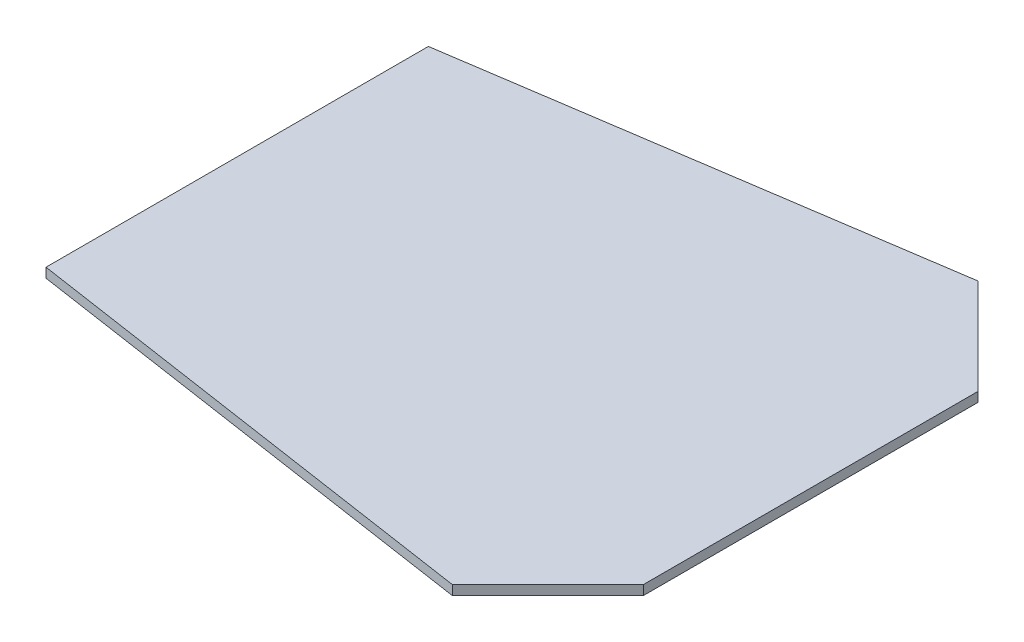
ISO-10303-21;
HEADER;
FILE_DESCRIPTION(('STEP AP214'),'2;1');
FILE_NAME('part.step','',(''),(''),'','','');
FILE_SCHEMA(('AUTOMOTIVE_DESIGN { 1 0 10303 214 1 1 1 1 }'));
ENDSEC;
DATA;
#1=APPLICATION_CONTEXT('core data for automotive mechanical design processes');
#2=APPLICATION_PROTOCOL_DEFINITION('international standard','automotive_design',2000,#1);
#3=PRODUCT_CONTEXT('',#1,'mechanical');
#4=PRODUCT('Part','Part','',(#3));
#5=PRODUCT_RELATED_PRODUCT_CATEGORY('part','',(#4));
#6=PRODUCT_DEFINITION_FORMATION('','',#4);
#7=PRODUCT_DEFINITION_CONTEXT('part definition',#1,'design');
#8=PRODUCT_DEFINITION('design','',#6,#7);
#9=PRODUCT_DEFINITION_SHAPE('','',#8);
#10=(LENGTH_UNIT() NAMED_UNIT(*) SI_UNIT(.MILLI.,.METRE.));
#11=(NAMED_UNIT(*) PLANE_ANGLE_UNIT() SI_UNIT($,.RADIAN.));
#12=(NAMED_UNIT(*) SI_UNIT($,.STERADIAN.) SOLID_ANGLE_UNIT());
#13=UNCERTAINTY_MEASURE_WITH_UNIT(LENGTH_MEASURE(1.E-05),#10,'distance_accuracy_value','');
#14=(GEOMETRIC_REPRESENTATION_CONTEXT(3) GLOBAL_UNCERTAINTY_ASSIGNED_CONTEXT((#13)) GLOBAL_UNIT_ASSIGNED_CONTEXT((#10,
#11,#12)) REPRESENTATION_CONTEXT('',''));
#15=CARTESIAN_POINT('',(0.,0.,0.));
#16=DIRECTION('',(0.,0.,1.));
#17=DIRECTION('',(1.,0.,0.));
#18=AXIS2_PLACEMENT_3D('',#15,#16,#17);
#19=CARTESIAN_POINT('',(0.,10.,-200.));
#20=DIRECTION('',(0.148340452930245,0.,0.988936352868298));
#21=DIRECTION('',(0.988936352868298,0.,-0.148340452930245));
#22=AXIS2_PLACEMENT_3D('',#19,#20,#21);
#23=PLANE('',#22);
#24=DIRECTION('',(-0.988936352868298,0.,0.148340452930245));
#25=VECTOR('',#24,1.);
#26=CARTESIAN_POINT('',(0.,0.,-200.));
#27=LINE('',#26,#25);
#28=CARTESIAN_POINT('',(500.,0.,-275.));
#29=VERTEX_POINT('',#28);
#30=CARTESIAN_POINT('',(0.,0.,-200.));
#31=VERTEX_POINT('',#30);
#32=EDGE_CURVE('E117',#29,#31,#27,.T.);
#33=ORIENTED_EDGE('',*,*,#32,.T.);
#34=DIRECTION('',(0.,-1.,0.));
#35=VECTOR('',#34,1.);
#36=CARTESIAN_POINT('',(0.,10.,-200.));
#37=LINE('',#36,#35);
#38=CARTESIAN_POINT('',(0.,10.,-200.));
#39=VERTEX_POINT('',#38);
#40=EDGE_CURVE('E11',#39,#31,#37,.T.);
#41=ORIENTED_EDGE('',*,*,#40,.F.);
#42=DIRECTION('',(-0.988936352868298,0.,0.148340452930245));
#43=VECTOR('',#42,1.);
#44=CARTESIAN_POINT('',(0.,10.,-200.));
#45=LINE('',#44,#43);
#46=CARTESIAN_POINT('',(500.,10.,-275.));
#47=VERTEX_POINT('',#46);
#48=EDGE_CURVE('E127',#47,#39,#45,.T.);
#49=ORIENTED_EDGE('',*,*,#48,.F.);
#50=DIRECTION('',(0.,-1.,0.));
#51=VECTOR('',#50,1.);
#52=CARTESIAN_POINT('',(500.,10.,-275.));
#53=LINE('',#52,#51);
#54=EDGE_CURVE('E113',#47,#29,#53,.T.);
#55=ORIENTED_EDGE('',*,*,#54,.T.);
#56=EDGE_LOOP('',(#33,#41,#49,#55));
#57=FACE_BOUND('',#56,.T.);
#58=ADVANCED_FACE('F33',(#57),#23,.F.);
#59=CARTESIAN_POINT('',(0.,10.,-200.));
#60=DIRECTION('',(1.,0.,0.));
#61=DIRECTION('',(0.,0.,-1.));
#62=AXIS2_PLACEMENT_3D('',#59,#60,#61);
#63=PLANE('',#62);
#64=DIRECTION('',(0.,0.,1.));
#65=VECTOR('',#64,1.);
#66=CARTESIAN_POINT('',(0.,0.,-200.));
#67=LINE('',#66,#65);
#68=CARTESIAN_POINT('',(0.,0.,200.));
#69=VERTEX_POINT('',#68);
#70=EDGE_CURVE('E120',#31,#69,#67,.T.);
#71=ORIENTED_EDGE('',*,*,#70,.T.);
#72=DIRECTION('',(0.,-1.,0.));
#73=VECTOR('',#72,1.);
#74=CARTESIAN_POINT('',(0.,10.,200.));
#75=LINE('',#74,#73);
#76=CARTESIAN_POINT('',(0.,10.,200.));
#77=VERTEX_POINT('',#76);
#78=EDGE_CURVE('E41',#77,#69,#75,.T.);
#79=ORIENTED_EDGE('',*,*,#78,.F.);
#80=DIRECTION('',(0.,0.,1.));
#81=VECTOR('',#80,1.);
#82=CARTESIAN_POINT('',(0.,10.,-200.));
#83=LINE('',#82,#81);
#84=EDGE_CURVE('E86',#39,#77,#83,.T.);
#85=ORIENTED_EDGE('',*,*,#84,.F.);
#86=ORIENTED_EDGE('',*,*,#40,.T.);
#87=EDGE_LOOP('',(#71,#79,#85,#86));
#88=FACE_BOUND('',#87,.T.);
#89=ADVANCED_FACE('F151',(#88),#63,.F.);
#90=CARTESIAN_POINT('',(0.,10.,200.));
#91=DIRECTION('',(0.148340452930245,0.,-0.988936352868298));
#92=DIRECTION('',(-0.988936352868298,0.,-0.148340452930245));
#93=AXIS2_PLACEMENT_3D('',#90,#91,#92);
#94=PLANE('',#93);
#95=DIRECTION('',(0.988936352868298,0.,0.148340452930245));
#96=VECTOR('',#95,1.);
#97=CARTESIAN_POINT('',(0.,0.,200.));
#98=LINE('',#97,#96);
#99=CARTESIAN_POINT('',(500.,0.,275.));
#100=VERTEX_POINT('',#99);
#101=EDGE_CURVE('E122',#69,#100,#98,.T.);
#102=ORIENTED_EDGE('',*,*,#101,.T.);
#103=DIRECTION('',(0.,-1.,0.));
#104=VECTOR('',#103,1.);
#105=CARTESIAN_POINT('',(500.,10.,275.));
#106=LINE('',#105,#104);
#107=CARTESIAN_POINT('',(500.,10.,275.));
#108=VERTEX_POINT('',#107);
#109=EDGE_CURVE('E108',#108,#100,#106,.T.);
#110=ORIENTED_EDGE('',*,*,#109,.F.);
#111=DIRECTION('',(0.988936352868298,0.,0.148340452930245));
#112=VECTOR('',#111,1.);
#113=CARTESIAN_POINT('',(0.,10.,200.));
#114=LINE('',#113,#112);
#115=EDGE_CURVE('E99',#77,#108,#114,.T.);
#116=ORIENTED_EDGE('',*,*,#115,.F.);
#117=ORIENTED_EDGE('',*,*,#78,.T.);
#118=EDGE_LOOP('',(#102,#110,#116,#117));
#119=FACE_BOUND('',#118,.T.);
#120=ADVANCED_FACE('F133',(#119),#94,.F.);
#121=CARTESIAN_POINT('',(600.,10.,175.));
#122=DIRECTION('',(-0.707106781186547,0.,-0.707106781186548));
#123=DIRECTION('',(-0.707106781186548,0.,0.707106781186547));
#124=AXIS2_PLACEMENT_3D('',#121,#122,#123);
#125=PLANE('',#124);
#126=DIRECTION('',(0.707106781186548,0.,-0.707106781186547));
#127=VECTOR('',#126,1.);
#128=CARTESIAN_POINT('',(600.,0.,175.));
#129=LINE('',#128,#127);
#130=CARTESIAN_POINT('',(600.,0.,175.));
#131=VERTEX_POINT('',#130);
#132=EDGE_CURVE('E107',#100,#131,#129,.T.);
#133=ORIENTED_EDGE('',*,*,#132,.T.);
#134=DIRECTION('',(0.,-1.,0.));
#135=VECTOR('',#134,1.);
#136=CARTESIAN_POINT('',(600.,10.,175.));
#137=LINE('',#136,#135);
#138=CARTESIAN_POINT('',(600.,10.,175.));
#139=VERTEX_POINT('',#138);
#140=EDGE_CURVE('E104',#139,#131,#137,.T.);
#141=ORIENTED_EDGE('',*,*,#140,.F.);
#142=DIRECTION('',(0.707106781186548,0.,-0.707106781186547));
#143=VECTOR('',#142,1.);
#144=CARTESIAN_POINT('',(600.,10.,175.));
#145=LINE('',#144,#143);
#146=EDGE_CURVE('E93',#108,#139,#145,.T.);
#147=ORIENTED_EDGE('',*,*,#146,.F.);
#148=ORIENTED_EDGE('',*,*,#109,.T.);
#149=EDGE_LOOP('',(#133,#141,#147,#148));
#150=FACE_BOUND('',#149,.T.);
#151=ADVANCED_FACE('F105',(#150),#125,.F.);
#152=CARTESIAN_POINT('',(600.,10.,-175.));
#153=DIRECTION('',(-1.,0.,0.));
#154=DIRECTION('',(0.,0.,1.));
#155=AXIS2_PLACEMENT_3D('',#152,#153,#154);
#156=PLANE('',#155);
#157=DIRECTION('',(0.,0.,-1.));
#158=VECTOR('',#157,1.);
#159=CARTESIAN_POINT('',(600.,0.,-175.));
#160=LINE('',#159,#158);
#161=CARTESIAN_POINT('',(600.,0.,-175.));
#162=VERTEX_POINT('',#161);
#163=EDGE_CURVE('E72',#131,#162,#160,.T.);
#164=ORIENTED_EDGE('',*,*,#163,.T.);
#165=DIRECTION('',(0.,-1.,0.));
#166=VECTOR('',#165,1.);
#167=CARTESIAN_POINT('',(600.,10.,-175.));
#168=LINE('',#167,#166);
#169=CARTESIAN_POINT('',(600.,10.,-175.));
#170=VERTEX_POINT('',#169);
#171=EDGE_CURVE('E109',#170,#162,#168,.T.);
#172=ORIENTED_EDGE('',*,*,#171,.F.);
#173=DIRECTION('',(0.,0.,-1.));
#174=VECTOR('',#173,1.);
#175=CARTESIAN_POINT('',(600.,10.,-175.));
#176=LINE('',#175,#174);
#177=EDGE_CURVE('E97',#139,#170,#176,.T.);
#178=ORIENTED_EDGE('',*,*,#177,.F.);
#179=ORIENTED_EDGE('',*,*,#140,.T.);
#180=EDGE_LOOP('',(#164,#172,#178,#179));
#181=FACE_BOUND('',#180,.T.);
#182=ADVANCED_FACE('F111',(#181),#156,.F.);
#183=CARTESIAN_POINT('',(600.,10.,-175.));
#184=DIRECTION('',(-0.707106781186548,0.,0.707106781186547));
#185=DIRECTION('',(0.707106781186547,0.,0.707106781186548));
#186=AXIS2_PLACEMENT_3D('',#183,#184,#185);
#187=PLANE('',#186);
#188=DIRECTION('',(-0.707106781186547,0.,-0.707106781186548));
#189=VECTOR('',#188,1.);
#190=CARTESIAN_POINT('',(600.,0.,-175.));
#191=LINE('',#190,#189);
#192=EDGE_CURVE('E78',#162,#29,#191,.T.);
#193=ORIENTED_EDGE('',*,*,#192,.T.);
#194=ORIENTED_EDGE('',*,*,#54,.F.);
#195=DIRECTION('',(-0.707106781186547,0.,-0.707106781186548));
#196=VECTOR('',#195,1.);
#197=CARTESIAN_POINT('',(600.,10.,-175.));
#198=LINE('',#197,#196);
#199=EDGE_CURVE('E49',#170,#47,#198,.T.);
#200=ORIENTED_EDGE('',*,*,#199,.F.);
#201=ORIENTED_EDGE('',*,*,#171,.T.);
#202=EDGE_LOOP('',(#193,#194,#200,#201));
#203=FACE_BOUND('',#202,.T.);
#204=ADVANCED_FACE('F140',(#203),#187,.F.);
#205=CARTESIAN_POINT('',(0.,10.,0.));
#206=DIRECTION('',(0.,-1.,0.));
#207=DIRECTION('',(0.,0.,-1.));
#208=AXIS2_PLACEMENT_3D('',#205,#206,#207);
#209=PLANE('',#208);
#210=ORIENTED_EDGE('',*,*,#48,.T.);
#211=ORIENTED_EDGE('',*,*,#84,.T.);
#212=ORIENTED_EDGE('',*,*,#115,.T.);
#213=ORIENTED_EDGE('',*,*,#146,.T.);
#214=ORIENTED_EDGE('',*,*,#177,.T.);
#215=ORIENTED_EDGE('',*,*,#199,.T.);
#216=EDGE_LOOP('',(#210,#211,#212,#213,#214,#215));
#217=FACE_BOUND('',#216,.T.);
#218=ADVANCED_FACE('F95',(#217),#209,.F.);
#219=CARTESIAN_POINT('',(0.,0.,0.));
#220=DIRECTION('',(0.,-1.,0.));
#221=DIRECTION('',(0.,0.,-1.));
#222=AXIS2_PLACEMENT_3D('',#219,#220,#221);
#223=PLANE('',#222);
#224=ORIENTED_EDGE('',*,*,#32,.F.);
#225=ORIENTED_EDGE('',*,*,#192,.F.);
#226=ORIENTED_EDGE('',*,*,#163,.F.);
#227=ORIENTED_EDGE('',*,*,#132,.F.);
#228=ORIENTED_EDGE('',*,*,#101,.F.);
#229=ORIENTED_EDGE('',*,*,#70,.F.);
#230=EDGE_LOOP('',(#224,#225,#226,#227,#228,#229));
#231=FACE_BOUND('',#230,.T.);
#232=ADVANCED_FACE('F136',(#231),#223,.T.);
#233=CLOSED_SHELL('',(#58,#89,#120,#151,#182,#204,#218,#232));
#234=MANIFOLD_SOLID_BREP('B2',#233);
#235=ADVANCED_BREP_SHAPE_REPRESENTATION('',(#18,#234),#14);
#236=SHAPE_DEFINITION_REPRESENTATION(#9,#235);
ENDSEC;
END-ISO-10303-21;
